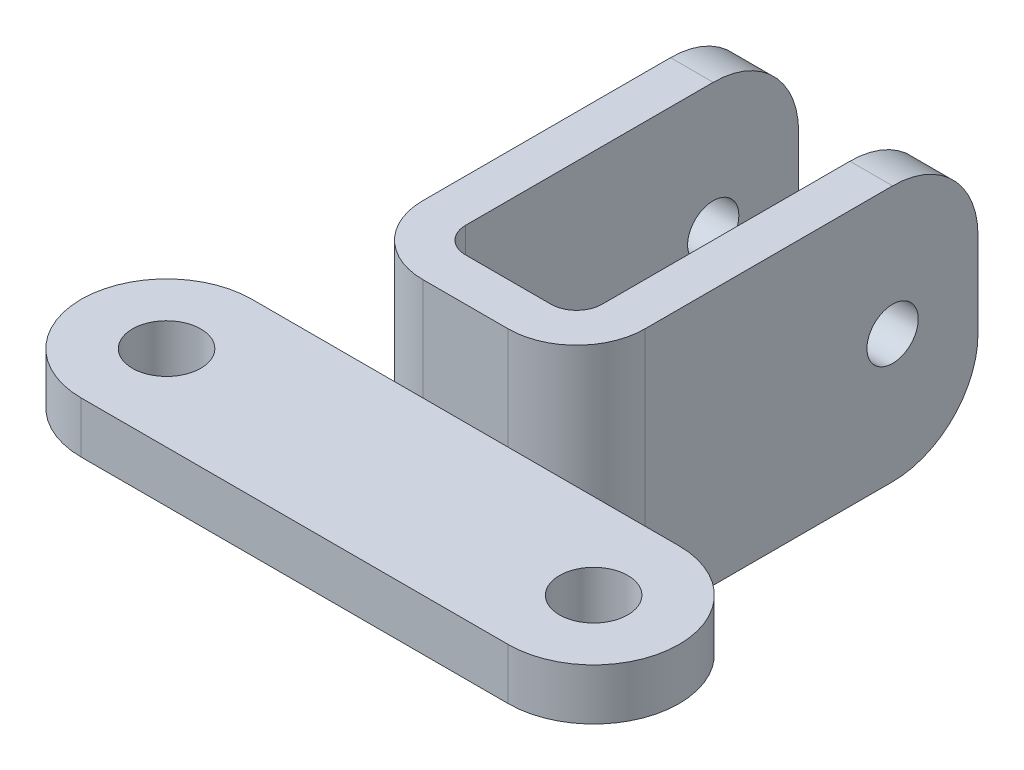
ISO-10303-21;
HEADER;
FILE_DESCRIPTION(('STEP AP214'),'2;1');
FILE_NAME('part.step','',(''),(''),'','','');
FILE_SCHEMA(('AUTOMOTIVE_DESIGN { 1 0 10303 214 1 1 1 1 }'));
ENDSEC;
DATA;
#1=APPLICATION_CONTEXT('core data for automotive mechanical design processes');
#2=APPLICATION_PROTOCOL_DEFINITION('international standard','automotive_design',2000,#1);
#3=PRODUCT_CONTEXT('',#1,'mechanical');
#4=PRODUCT('Part','Part','',(#3));
#5=PRODUCT_RELATED_PRODUCT_CATEGORY('part','',(#4));
#6=PRODUCT_DEFINITION_FORMATION('','',#4);
#7=PRODUCT_DEFINITION_CONTEXT('part definition',#1,'design');
#8=PRODUCT_DEFINITION('design','',#6,#7);
#9=PRODUCT_DEFINITION_SHAPE('','',#8);
#10=(LENGTH_UNIT() NAMED_UNIT(*) SI_UNIT(.MILLI.,.METRE.));
#11=(NAMED_UNIT(*) PLANE_ANGLE_UNIT() SI_UNIT($,.RADIAN.));
#12=(NAMED_UNIT(*) SI_UNIT($,.STERADIAN.) SOLID_ANGLE_UNIT());
#13=UNCERTAINTY_MEASURE_WITH_UNIT(LENGTH_MEASURE(1.E-05),#10,'distance_accuracy_value','');
#14=(GEOMETRIC_REPRESENTATION_CONTEXT(3) GLOBAL_UNCERTAINTY_ASSIGNED_CONTEXT((#13)) GLOBAL_UNIT_ASSIGNED_CONTEXT((#10,
#11,#12)) REPRESENTATION_CONTEXT('',''));
#15=CARTESIAN_POINT('',(0.,0.,0.));
#16=DIRECTION('',(0.,0.,1.));
#17=DIRECTION('',(1.,0.,0.));
#18=AXIS2_PLACEMENT_3D('',#15,#16,#17);
#19=CARTESIAN_POINT('',(0.,15.,0.));
#20=DIRECTION('',(0.,0.,-1.));
#21=DIRECTION('',(-1.,0.,0.));
#22=AXIS2_PLACEMENT_3D('',#19,#20,#21);
#23=PLANE('',#22);
#24=DIRECTION('',(1.,0.,0.));
#25=VECTOR('',#24,1.);
#26=CARTESIAN_POINT('',(0.,-3.,0.));
#27=LINE('',#26,#25);
#28=CARTESIAN_POINT('',(-5.,-3.,0.));
#29=VERTEX_POINT('',#28);
#30=CARTESIAN_POINT('',(4.99999999999999,-3.,0.));
#31=VERTEX_POINT('',#30);
#32=EDGE_CURVE('E57',#29,#31,#27,.T.);
#33=ORIENTED_EDGE('',*,*,#32,.F.);
#34=DIRECTION('',(0.,-1.,0.));
#35=VECTOR('',#34,1.);
#36=CARTESIAN_POINT('',(-5.,15.,0.));
#37=LINE('',#36,#35);
#38=CARTESIAN_POINT('',(-5.,-15.,0.));
#39=VERTEX_POINT('',#38);
#40=EDGE_CURVE('E308',#29,#39,#37,.T.);
#41=ORIENTED_EDGE('',*,*,#40,.T.);
#42=DIRECTION('',(1.,0.,0.));
#43=VECTOR('',#42,1.);
#44=CARTESIAN_POINT('',(0.,-15.,0.));
#45=LINE('',#44,#43);
#46=CARTESIAN_POINT('',(4.99999999999999,-15.,0.));
#47=VERTEX_POINT('',#46);
#48=EDGE_CURVE('E298',#39,#47,#45,.T.);
#49=ORIENTED_EDGE('',*,*,#48,.T.);
#50=DIRECTION('',(0.,-1.,0.));
#51=VECTOR('',#50,1.);
#52=CARTESIAN_POINT('',(4.99999999999999,15.,0.));
#53=LINE('',#52,#51);
#54=EDGE_CURVE('E304',#31,#47,#53,.T.);
#55=ORIENTED_EDGE('',*,*,#54,.F.);
#56=EDGE_LOOP('',(#33,#41,#49,#55));
#57=FACE_BOUND('',#56,.T.);
#58=ADVANCED_FACE('F41',(#57),#23,.F.);
#59=CARTESIAN_POINT('',(13.,15.,-8.));
#60=DIRECTION('',(-1.,0.,0.));
#61=DIRECTION('',(0.,0.,1.));
#62=AXIS2_PLACEMENT_3D('',#59,#60,#61);
#63=PLANE('',#62);
#64=CARTESIAN_POINT('',(13.,0.,-37.));
#65=DIRECTION('',(-1.,0.,0.));
#66=DIRECTION('',(0.,0.,1.));
#67=AXIS2_PLACEMENT_3D('',#64,#65,#66);
#68=CIRCLE('',#67,3.);
#69=CARTESIAN_POINT('',(13.,0.,-34.));
#70=VERTEX_POINT('',#69);
#71=EDGE_CURVE('E231',#70,#70,#68,.T.);
#72=ORIENTED_EDGE('',*,*,#71,.T.);
#73=EDGE_LOOP('',(#72));
#74=FACE_BOUND('',#73,.T.);
#75=DIRECTION('',(0.,-1.,0.));
#76=VECTOR('',#75,1.);
#77=CARTESIAN_POINT('',(13.,15.,-47.));
#78=LINE('',#77,#76);
#79=CARTESIAN_POINT('',(13.,5.,-47.));
#80=VERTEX_POINT('',#79);
#81=CARTESIAN_POINT('',(13.,-5.,-47.));
#82=VERTEX_POINT('',#81);
#83=EDGE_CURVE('E333',#80,#82,#78,.T.);
#84=ORIENTED_EDGE('',*,*,#83,.F.);
#85=CARTESIAN_POINT('',(13.,5.,-37.));
#86=DIRECTION('',(-1.,0.,0.));
#87=DIRECTION('',(0.,0.,1.));
#88=AXIS2_PLACEMENT_3D('',#85,#86,#87);
#89=CIRCLE('',#88,10.);
#90=CARTESIAN_POINT('',(13.,15.,-37.));
#91=VERTEX_POINT('',#90);
#92=EDGE_CURVE('E343',#80,#91,#89,.F.);
#93=ORIENTED_EDGE('',*,*,#92,.T.);
#94=DIRECTION('',(0.,0.,-1.));
#95=VECTOR('',#94,1.);
#96=CARTESIAN_POINT('',(13.,15.,-8.));
#97=LINE('',#96,#95);
#98=CARTESIAN_POINT('',(13.,15.,-8.));
#99=VERTEX_POINT('',#98);
#100=EDGE_CURVE('E251',#99,#91,#97,.T.);
#101=ORIENTED_EDGE('',*,*,#100,.F.);
#102=DIRECTION('',(0.,-1.,0.));
#103=VECTOR('',#102,1.);
#104=CARTESIAN_POINT('',(13.,15.,-8.));
#105=LINE('',#104,#103);
#106=CARTESIAN_POINT('',(13.,-15.,-8.));
#107=VERTEX_POINT('',#106);
#108=EDGE_CURVE('E277',#99,#107,#105,.T.);
#109=ORIENTED_EDGE('',*,*,#108,.T.);
#110=DIRECTION('',(0.,0.,-1.));
#111=VECTOR('',#110,1.);
#112=CARTESIAN_POINT('',(13.,-15.,-8.));
#113=LINE('',#112,#111);
#114=CARTESIAN_POINT('',(13.,-15.,-37.));
#115=VERTEX_POINT('',#114);
#116=EDGE_CURVE('E250',#107,#115,#113,.T.);
#117=ORIENTED_EDGE('',*,*,#116,.T.);
#118=CARTESIAN_POINT('',(13.,-5.,-37.));
#119=DIRECTION('',(-1.,0.,0.));
#120=DIRECTION('',(0.,0.,1.));
#121=AXIS2_PLACEMENT_3D('',#118,#119,#120);
#122=CIRCLE('',#121,10.);
#123=EDGE_CURVE('E341',#115,#82,#122,.F.);
#124=ORIENTED_EDGE('',*,*,#123,.T.);
#125=EDGE_LOOP('',(#84,#93,#101,#109,#117,#124));
#126=FACE_BOUND('',#125,.T.);
#127=ADVANCED_FACE('F426',(#74,#126),#63,.F.);
#128=CARTESIAN_POINT('',(7.99999999999999,15.,-47.));
#129=DIRECTION('',(0.,0.,-1.));
#130=DIRECTION('',(-1.,0.,0.));
#131=AXIS2_PLACEMENT_3D('',#128,#129,#130);
#132=PLANE('',#131);
#133=DIRECTION('',(0.,-1.,0.));
#134=VECTOR('',#133,1.);
#135=CARTESIAN_POINT('',(7.99999999999999,15.,-47.));
#136=LINE('',#135,#134);
#137=CARTESIAN_POINT('',(7.99999999999999,5.,-47.));
#138=VERTEX_POINT('',#137);
#139=CARTESIAN_POINT('',(7.99999999999999,-5.,-47.));
#140=VERTEX_POINT('',#139);
#141=EDGE_CURVE('E330',#138,#140,#136,.T.);
#142=ORIENTED_EDGE('',*,*,#141,.F.);
#143=DIRECTION('',(1.,0.,0.));
#144=VECTOR('',#143,1.);
#145=CARTESIAN_POINT('',(7.99999999999999,5.,-47.));
#146=LINE('',#145,#144);
#147=EDGE_CURVE('E338',#138,#80,#146,.T.);
#148=ORIENTED_EDGE('',*,*,#147,.T.);
#149=ORIENTED_EDGE('',*,*,#83,.T.);
#150=DIRECTION('',(1.,0.,0.));
#151=VECTOR('',#150,1.);
#152=CARTESIAN_POINT('',(7.99999999999999,-5.,-47.));
#153=LINE('',#152,#151);
#154=EDGE_CURVE('E336',#82,#140,#153,.F.);
#155=ORIENTED_EDGE('',*,*,#154,.T.);
#156=EDGE_LOOP('',(#142,#148,#149,#155));
#157=FACE_BOUND('',#156,.T.);
#158=ADVANCED_FACE('F433',(#157),#132,.T.);
#159=CARTESIAN_POINT('',(7.99999999999999,15.,-8.));
#160=DIRECTION('',(-1.,0.,0.));
#161=DIRECTION('',(0.,0.,1.));
#162=AXIS2_PLACEMENT_3D('',#159,#160,#161);
#163=PLANE('',#162);
#164=CARTESIAN_POINT('',(7.99999999999999,0.,-37.));
#165=DIRECTION('',(-1.,0.,0.));
#166=DIRECTION('',(0.,0.,1.));
#167=AXIS2_PLACEMENT_3D('',#164,#165,#166);
#168=CIRCLE('',#167,3.);
#169=CARTESIAN_POINT('',(7.99999999999999,0.,-34.));
#170=VERTEX_POINT('',#169);
#171=EDGE_CURVE('E488',#170,#170,#168,.T.);
#172=ORIENTED_EDGE('',*,*,#171,.F.);
#173=EDGE_LOOP('',(#172));
#174=FACE_BOUND('',#173,.T.);
#175=DIRECTION('',(0.,0.,-1.));
#176=VECTOR('',#175,1.);
#177=CARTESIAN_POINT('',(7.99999999999999,15.,-8.));
#178=LINE('',#177,#176);
#179=CARTESIAN_POINT('',(7.99999999999999,15.,-8.));
#180=VERTEX_POINT('',#179);
#181=CARTESIAN_POINT('',(7.99999999999999,15.,-37.));
#182=VERTEX_POINT('',#181);
#183=EDGE_CURVE('E254',#180,#182,#178,.T.);
#184=ORIENTED_EDGE('',*,*,#183,.T.);
#185=CARTESIAN_POINT('',(7.99999999999999,5.,-37.));
#186=DIRECTION('',(-1.,0.,0.));
#187=DIRECTION('',(0.,0.,1.));
#188=AXIS2_PLACEMENT_3D('',#185,#186,#187);
#189=CIRCLE('',#188,10.);
#190=EDGE_CURVE('E351',#182,#138,#189,.T.);
#191=ORIENTED_EDGE('',*,*,#190,.T.);
#192=ORIENTED_EDGE('',*,*,#141,.T.);
#193=CARTESIAN_POINT('',(7.99999999999999,-5.,-37.));
#194=DIRECTION('',(-1.,0.,0.));
#195=DIRECTION('',(0.,0.,1.));
#196=AXIS2_PLACEMENT_3D('',#193,#194,#195);
#197=CIRCLE('',#196,10.);
#198=CARTESIAN_POINT('',(7.99999999999999,-15.,-37.));
#199=VERTEX_POINT('',#198);
#200=EDGE_CURVE('E349',#140,#199,#197,.T.);
#201=ORIENTED_EDGE('',*,*,#200,.T.);
#202=DIRECTION('',(0.,0.,-1.));
#203=VECTOR('',#202,1.);
#204=CARTESIAN_POINT('',(7.99999999999999,-15.,-8.));
#205=LINE('',#204,#203);
#206=CARTESIAN_POINT('',(7.99999999999999,-15.,-8.));
#207=VERTEX_POINT('',#206);
#208=EDGE_CURVE('E280',#207,#199,#205,.T.);
#209=ORIENTED_EDGE('',*,*,#208,.F.);
#210=DIRECTION('',(0.,-1.,0.));
#211=VECTOR('',#210,1.);
#212=CARTESIAN_POINT('',(7.99999999999999,15.,-8.));
#213=LINE('',#212,#211);
#214=EDGE_CURVE('E328',#180,#207,#213,.T.);
#215=ORIENTED_EDGE('',*,*,#214,.F.);
#216=EDGE_LOOP('',(#184,#191,#192,#201,#209,#215));
#217=FACE_BOUND('',#216,.T.);
#218=ADVANCED_FACE('F437',(#174,#217),#163,.T.);
#219=CARTESIAN_POINT('',(4.99999999999999,15.,-8.));
#220=DIRECTION('',(0.,-1.,0.));
#221=DIRECTION('',(0.,0.,-1.));
#222=AXIS2_PLACEMENT_3D('',#219,#220,#221);
#223=CYLINDRICAL_SURFACE('',#222,3.);
#224=CARTESIAN_POINT('',(4.99999999999999,-15.,-8.));
#225=DIRECTION('',(0.,1.,0.));
#226=DIRECTION('',(1.,0.,0.));
#227=AXIS2_PLACEMENT_3D('',#224,#225,#226);
#228=CIRCLE('',#227,3.);
#229=CARTESIAN_POINT('',(4.99999999999999,-15.,-5.));
#230=VERTEX_POINT('',#229);
#231=EDGE_CURVE('E283',#230,#207,#228,.T.);
#232=ORIENTED_EDGE('',*,*,#231,.F.);
#233=DIRECTION('',(0.,-1.,0.));
#234=VECTOR('',#233,1.);
#235=CARTESIAN_POINT('',(4.99999999999999,15.,-5.));
#236=LINE('',#235,#234);
#237=CARTESIAN_POINT('',(4.99999999999999,15.,-5.));
#238=VERTEX_POINT('',#237);
#239=EDGE_CURVE('E325',#238,#230,#236,.T.);
#240=ORIENTED_EDGE('',*,*,#239,.F.);
#241=CARTESIAN_POINT('',(4.99999999999999,15.,-8.));
#242=DIRECTION('',(0.,1.,0.));
#243=DIRECTION('',(1.,0.,0.));
#244=AXIS2_PLACEMENT_3D('',#241,#242,#243);
#245=CIRCLE('',#244,3.);
#246=EDGE_CURVE('E258',#238,#180,#245,.T.);
#247=ORIENTED_EDGE('',*,*,#246,.T.);
#248=ORIENTED_EDGE('',*,*,#214,.T.);
#249=EDGE_LOOP('',(#232,#240,#247,#248));
#250=FACE_BOUND('',#249,.T.);
#251=ADVANCED_FACE('F445',(#250),#223,.F.);
#252=CARTESIAN_POINT('',(-5.,15.,-5.));
#253=DIRECTION('',(0.,0.,-1.));
#254=DIRECTION('',(-1.,0.,0.));
#255=AXIS2_PLACEMENT_3D('',#252,#253,#254);
#256=PLANE('',#255);
#257=DIRECTION('',(1.,0.,0.));
#258=VECTOR('',#257,1.);
#259=CARTESIAN_POINT('',(-5.,-15.,-5.));
#260=LINE('',#259,#258);
#261=CARTESIAN_POINT('',(-5.,-15.,-5.));
#262=VERTEX_POINT('',#261);
#263=EDGE_CURVE('E286',#262,#230,#260,.T.);
#264=ORIENTED_EDGE('',*,*,#263,.F.);
#265=DIRECTION('',(0.,-1.,0.));
#266=VECTOR('',#265,1.);
#267=CARTESIAN_POINT('',(-5.,15.,-5.));
#268=LINE('',#267,#266);
#269=CARTESIAN_POINT('',(-5.,15.,-5.));
#270=VERTEX_POINT('',#269);
#271=EDGE_CURVE('E323',#270,#262,#268,.T.);
#272=ORIENTED_EDGE('',*,*,#271,.F.);
#273=DIRECTION('',(1.,0.,0.));
#274=VECTOR('',#273,1.);
#275=CARTESIAN_POINT('',(0.,15.,-5.));
#276=LINE('',#275,#274);
#277=EDGE_CURVE('E261',#270,#238,#276,.T.);
#278=ORIENTED_EDGE('',*,*,#277,.T.);
#279=ORIENTED_EDGE('',*,*,#239,.T.);
#280=EDGE_LOOP('',(#264,#272,#278,#279));
#281=FACE_BOUND('',#280,.T.);
#282=ADVANCED_FACE('F447',(#281),#256,.T.);
#283=CARTESIAN_POINT('',(-5.,15.,-8.));
#284=DIRECTION('',(0.,-1.,0.));
#285=DIRECTION('',(0.,0.,-1.));
#286=AXIS2_PLACEMENT_3D('',#283,#284,#285);
#287=CYLINDRICAL_SURFACE('',#286,3.);
#288=CARTESIAN_POINT('',(-5.,-15.,-8.));
#289=DIRECTION('',(0.,1.,0.));
#290=DIRECTION('',(1.,0.,0.));
#291=AXIS2_PLACEMENT_3D('',#288,#289,#290);
#292=CIRCLE('',#291,3.);
#293=CARTESIAN_POINT('',(-8.,-15.,-8.));
#294=VERTEX_POINT('',#293);
#295=EDGE_CURVE('E288',#294,#262,#292,.T.);
#296=ORIENTED_EDGE('',*,*,#295,.F.);
#297=DIRECTION('',(0.,-1.,0.));
#298=VECTOR('',#297,1.);
#299=CARTESIAN_POINT('',(-8.,15.,-8.));
#300=LINE('',#299,#298);
#301=CARTESIAN_POINT('',(-8.,15.,-8.));
#302=VERTEX_POINT('',#301);
#303=EDGE_CURVE('E320',#302,#294,#300,.T.);
#304=ORIENTED_EDGE('',*,*,#303,.F.);
#305=CARTESIAN_POINT('',(-5.,15.,-8.));
#306=DIRECTION('',(0.,1.,0.));
#307=DIRECTION('',(1.,0.,0.));
#308=AXIS2_PLACEMENT_3D('',#305,#306,#307);
#309=CIRCLE('',#308,3.);
#310=EDGE_CURVE('E264',#302,#270,#309,.T.);
#311=ORIENTED_EDGE('',*,*,#310,.T.);
#312=ORIENTED_EDGE('',*,*,#271,.T.);
#313=EDGE_LOOP('',(#296,#304,#311,#312));
#314=FACE_BOUND('',#313,.T.);
#315=ADVANCED_FACE('F390',(#314),#287,.F.);
#316=CARTESIAN_POINT('',(-8.,15.,-47.));
#317=DIRECTION('',(1.,0.,0.));
#318=DIRECTION('',(0.,0.,-1.));
#319=AXIS2_PLACEMENT_3D('',#316,#317,#318);
#320=PLANE('',#319);
#321=CARTESIAN_POINT('',(-8.,0.,-37.));
#322=DIRECTION('',(1.,0.,0.));
#323=DIRECTION('',(0.,0.,-1.));
#324=AXIS2_PLACEMENT_3D('',#321,#322,#323);
#325=CIRCLE('',#324,3.);
#326=CARTESIAN_POINT('',(-8.,0.,-40.));
#327=VERTEX_POINT('',#326);
#328=EDGE_CURVE('E486',#327,#327,#325,.T.);
#329=ORIENTED_EDGE('',*,*,#328,.F.);
#330=EDGE_LOOP('',(#329));
#331=FACE_BOUND('',#330,.T.);
#332=DIRECTION('',(0.,0.,1.));
#333=VECTOR('',#332,1.);
#334=CARTESIAN_POINT('',(-8.,-15.,-47.));
#335=LINE('',#334,#333);
#336=CARTESIAN_POINT('',(-8.,-15.,-37.));
#337=VERTEX_POINT('',#336);
#338=EDGE_CURVE('E291',#337,#294,#335,.T.);
#339=ORIENTED_EDGE('',*,*,#338,.F.);
#340=CARTESIAN_POINT('',(-8.,-5.,-37.));
#341=DIRECTION('',(1.,0.,0.));
#342=DIRECTION('',(0.,0.,-1.));
#343=AXIS2_PLACEMENT_3D('',#340,#341,#342);
#344=CIRCLE('',#343,10.);
#345=CARTESIAN_POINT('',(-8.,-5.,-47.));
#346=VERTEX_POINT('',#345);
#347=EDGE_CURVE('E361',#337,#346,#344,.T.);
#348=ORIENTED_EDGE('',*,*,#347,.T.);
#349=DIRECTION('',(0.,-1.,0.));
#350=VECTOR('',#349,1.);
#351=CARTESIAN_POINT('',(-8.,15.,-47.));
#352=LINE('',#351,#350);
#353=CARTESIAN_POINT('',(-8.,5.,-47.));
#354=VERTEX_POINT('',#353);
#355=EDGE_CURVE('E318',#354,#346,#352,.T.);
#356=ORIENTED_EDGE('',*,*,#355,.F.);
#357=CARTESIAN_POINT('',(-8.,5.,-37.));
#358=DIRECTION('',(1.,0.,0.));
#359=DIRECTION('',(0.,0.,-1.));
#360=AXIS2_PLACEMENT_3D('',#357,#358,#359);
#361=CIRCLE('',#360,10.);
#362=CARTESIAN_POINT('',(-8.,15.,-37.));
#363=VERTEX_POINT('',#362);
#364=EDGE_CURVE('E359',#354,#363,#361,.T.);
#365=ORIENTED_EDGE('',*,*,#364,.T.);
#366=DIRECTION('',(0.,0.,1.));
#367=VECTOR('',#366,1.);
#368=CARTESIAN_POINT('',(-8.,15.,-47.));
#369=LINE('',#368,#367);
#370=EDGE_CURVE('E267',#363,#302,#369,.T.);
#371=ORIENTED_EDGE('',*,*,#370,.T.);
#372=ORIENTED_EDGE('',*,*,#303,.T.);
#373=EDGE_LOOP('',(#339,#348,#356,#365,#371,#372));
#374=FACE_BOUND('',#373,.T.);
#375=ADVANCED_FACE('F381',(#331,#374),#320,.T.);
#376=CARTESIAN_POINT('',(-13.,15.,-47.));
#377=DIRECTION('',(0.,0.,-1.));
#378=DIRECTION('',(-1.,0.,0.));
#379=AXIS2_PLACEMENT_3D('',#376,#377,#378);
#380=PLANE('',#379);
#381=ORIENTED_EDGE('',*,*,#355,.T.);
#382=DIRECTION('',(1.,0.,0.));
#383=VECTOR('',#382,1.);
#384=CARTESIAN_POINT('',(-13.,-5.,-47.));
#385=LINE('',#384,#383);
#386=CARTESIAN_POINT('',(-13.,-5.,-47.));
#387=VERTEX_POINT('',#386);
#388=EDGE_CURVE('E65',#346,#387,#385,.F.);
#389=ORIENTED_EDGE('',*,*,#388,.T.);
#390=DIRECTION('',(0.,-1.,0.));
#391=VECTOR('',#390,1.);
#392=CARTESIAN_POINT('',(-13.,15.,-47.));
#393=LINE('',#392,#391);
#394=CARTESIAN_POINT('',(-13.,5.,-47.));
#395=VERTEX_POINT('',#394);
#396=EDGE_CURVE('E316',#395,#387,#393,.T.);
#397=ORIENTED_EDGE('',*,*,#396,.F.);
#398=DIRECTION('',(1.,0.,0.));
#399=VECTOR('',#398,1.);
#400=CARTESIAN_POINT('',(-13.,5.,-47.));
#401=LINE('',#400,#399);
#402=EDGE_CURVE('E363',#395,#354,#401,.T.);
#403=ORIENTED_EDGE('',*,*,#402,.T.);
#404=EDGE_LOOP('',(#381,#389,#397,#403));
#405=FACE_BOUND('',#404,.T.);
#406=ADVANCED_FACE('F376',(#405),#380,.T.);
#407=CARTESIAN_POINT('',(-13.,15.,-47.));
#408=DIRECTION('',(1.,0.,0.));
#409=DIRECTION('',(0.,0.,-1.));
#410=AXIS2_PLACEMENT_3D('',#407,#408,#409);
#411=PLANE('',#410);
#412=CARTESIAN_POINT('',(-13.,0.,-37.));
#413=DIRECTION('',(1.,0.,0.));
#414=DIRECTION('',(0.,0.,-1.));
#415=AXIS2_PLACEMENT_3D('',#412,#413,#414);
#416=CIRCLE('',#415,3.);
#417=CARTESIAN_POINT('',(-13.,0.,-40.));
#418=VERTEX_POINT('',#417);
#419=EDGE_CURVE('E45',#418,#418,#416,.T.);
#420=ORIENTED_EDGE('',*,*,#419,.T.);
#421=EDGE_LOOP('',(#420));
#422=FACE_BOUND('',#421,.T.);
#423=ORIENTED_EDGE('',*,*,#396,.T.);
#424=CARTESIAN_POINT('',(-13.,-5.,-37.));
#425=DIRECTION('',(1.,0.,0.));
#426=DIRECTION('',(0.,0.,-1.));
#427=AXIS2_PLACEMENT_3D('',#424,#425,#426);
#428=CIRCLE('',#427,10.);
#429=CARTESIAN_POINT('',(-13.,-15.,-37.));
#430=VERTEX_POINT('',#429);
#431=EDGE_CURVE('E11',#387,#430,#428,.F.);
#432=ORIENTED_EDGE('',*,*,#431,.T.);
#433=DIRECTION('',(0.,0.,1.));
#434=VECTOR('',#433,1.);
#435=CARTESIAN_POINT('',(-13.,-15.,-47.));
#436=LINE('',#435,#434);
#437=CARTESIAN_POINT('',(-13.,-15.,-8.));
#438=VERTEX_POINT('',#437);
#439=EDGE_CURVE('E293',#430,#438,#436,.T.);
#440=ORIENTED_EDGE('',*,*,#439,.T.);
#441=DIRECTION('',(0.,-1.,0.));
#442=VECTOR('',#441,1.);
#443=CARTESIAN_POINT('',(-13.,15.,-8.));
#444=LINE('',#443,#442);
#445=CARTESIAN_POINT('',(-13.,15.,-8.));
#446=VERTEX_POINT('',#445);
#447=EDGE_CURVE('E313',#446,#438,#444,.T.);
#448=ORIENTED_EDGE('',*,*,#447,.F.);
#449=DIRECTION('',(0.,0.,1.));
#450=VECTOR('',#449,1.);
#451=CARTESIAN_POINT('',(-13.,15.,-47.));
#452=LINE('',#451,#450);
#453=CARTESIAN_POINT('',(-13.,15.,-37.));
#454=VERTEX_POINT('',#453);
#455=EDGE_CURVE('E269',#454,#446,#452,.T.);
#456=ORIENTED_EDGE('',*,*,#455,.F.);
#457=CARTESIAN_POINT('',(-13.,5.,-37.));
#458=DIRECTION('',(1.,0.,0.));
#459=DIRECTION('',(0.,0.,-1.));
#460=AXIS2_PLACEMENT_3D('',#457,#458,#459);
#461=CIRCLE('',#460,10.);
#462=EDGE_CURVE('E50',#454,#395,#461,.F.);
#463=ORIENTED_EDGE('',*,*,#462,.T.);
#464=EDGE_LOOP('',(#423,#432,#440,#448,#456,#463));
#465=FACE_BOUND('',#464,.T.);
#466=ADVANCED_FACE('F370',(#422,#465),#411,.F.);
#467=CARTESIAN_POINT('',(-5.,15.,-8.));
#468=DIRECTION('',(0.,-1.,0.));
#469=DIRECTION('',(0.,0.,-1.));
#470=AXIS2_PLACEMENT_3D('',#467,#468,#469);
#471=CYLINDRICAL_SURFACE('',#470,8.);
#472=CARTESIAN_POINT('',(-5.,-15.,-8.));
#473=DIRECTION('',(0.,1.,0.));
#474=DIRECTION('',(0.,0.,1.));
#475=AXIS2_PLACEMENT_3D('',#472,#473,#474);
#476=CIRCLE('',#475,8.);
#477=EDGE_CURVE('E295',#438,#39,#476,.T.);
#478=ORIENTED_EDGE('',*,*,#477,.T.);
#479=ORIENTED_EDGE('',*,*,#40,.F.);
#480=DIRECTION('',(0.,-1.,0.));
#481=VECTOR('',#480,1.);
#482=CARTESIAN_POINT('',(-5.,15.,0.));
#483=LINE('',#482,#481);
#484=CARTESIAN_POINT('',(-5.,3.,0.));
#485=VERTEX_POINT('',#484);
#486=EDGE_CURVE('E204',#485,#29,#483,.T.);
#487=ORIENTED_EDGE('',*,*,#486,.F.);
#488=CARTESIAN_POINT('',(-5.,15.,0.));
#489=VERTEX_POINT('',#488);
#490=EDGE_CURVE('E310',#489,#485,#37,.T.);
#491=ORIENTED_EDGE('',*,*,#490,.F.);
#492=CARTESIAN_POINT('',(-5.,15.,-8.));
#493=DIRECTION('',(0.,1.,0.));
#494=DIRECTION('',(0.,0.,1.));
#495=AXIS2_PLACEMENT_3D('',#492,#493,#494);
#496=CIRCLE('',#495,8.);
#497=EDGE_CURVE('E271',#446,#489,#496,.T.);
#498=ORIENTED_EDGE('',*,*,#497,.F.);
#499=ORIENTED_EDGE('',*,*,#447,.T.);
#500=EDGE_LOOP('',(#478,#479,#487,#491,#498,#499));
#501=FACE_BOUND('',#500,.T.);
#502=ADVANCED_FACE('F401',(#501),#471,.T.);
#503=ORIENTED_EDGE('',*,*,#490,.T.);
#504=DIRECTION('',(1.,0.,0.));
#505=VECTOR('',#504,1.);
#506=CARTESIAN_POINT('',(0.,3.,0.));
#507=LINE('',#506,#505);
#508=CARTESIAN_POINT('',(4.99999999999999,3.,0.));
#509=VERTEX_POINT('',#508);
#510=EDGE_CURVE('E226',#485,#509,#507,.T.);
#511=ORIENTED_EDGE('',*,*,#510,.T.);
#512=CARTESIAN_POINT('',(4.99999999999999,15.,0.));
#513=VERTEX_POINT('',#512);
#514=EDGE_CURVE('E305',#513,#509,#53,.T.);
#515=ORIENTED_EDGE('',*,*,#514,.F.);
#516=DIRECTION('',(1.,0.,0.));
#517=VECTOR('',#516,1.);
#518=CARTESIAN_POINT('',(-5.,15.,0.));
#519=LINE('',#518,#517);
#520=EDGE_CURVE('E273',#489,#513,#519,.T.);
#521=ORIENTED_EDGE('',*,*,#520,.F.);
#522=EDGE_LOOP('',(#503,#511,#515,#521));
#523=FACE_BOUND('',#522,.T.);
#524=ADVANCED_FACE('F416',(#523),#23,.F.);
#525=CARTESIAN_POINT('',(4.99999999999999,15.,-8.));
#526=DIRECTION('',(0.,-1.,0.));
#527=DIRECTION('',(0.,0.,-1.));
#528=AXIS2_PLACEMENT_3D('',#525,#526,#527);
#529=CYLINDRICAL_SURFACE('',#528,8.);
#530=CARTESIAN_POINT('',(4.99999999999999,-15.,-8.));
#531=DIRECTION('',(0.,1.,0.));
#532=DIRECTION('',(0.,0.,1.));
#533=AXIS2_PLACEMENT_3D('',#530,#531,#532);
#534=CIRCLE('',#533,8.);
#535=EDGE_CURVE('E255',#47,#107,#534,.T.);
#536=ORIENTED_EDGE('',*,*,#535,.T.);
#537=ORIENTED_EDGE('',*,*,#108,.F.);
#538=CARTESIAN_POINT('',(4.99999999999999,15.,-8.));
#539=DIRECTION('',(0.,1.,0.));
#540=DIRECTION('',(0.,0.,1.));
#541=AXIS2_PLACEMENT_3D('',#538,#539,#540);
#542=CIRCLE('',#541,8.);
#543=EDGE_CURVE('E275',#513,#99,#542,.T.);
#544=ORIENTED_EDGE('',*,*,#543,.F.);
#545=ORIENTED_EDGE('',*,*,#514,.T.);
#546=EDGE_CURVE('E309',#509,#31,#53,.T.);
#547=ORIENTED_EDGE('',*,*,#546,.T.);
#548=ORIENTED_EDGE('',*,*,#54,.T.);
#549=EDGE_LOOP('',(#536,#537,#544,#545,#547,#548));
#550=FACE_BOUND('',#549,.T.);
#551=ADVANCED_FACE('F423',(#550),#529,.T.);
#552=CARTESIAN_POINT('',(4.99999999999999,15.,-8.));
#553=DIRECTION('',(0.,1.,0.));
#554=DIRECTION('',(1.,0.,0.));
#555=AXIS2_PLACEMENT_3D('',#552,#553,#554);
#556=PLANE('',#555);
#557=ORIENTED_EDGE('',*,*,#100,.T.);
#558=DIRECTION('',(1.,0.,0.));
#559=VECTOR('',#558,1.);
#560=CARTESIAN_POINT('',(4.99999999999999,15.,-37.));
#561=LINE('',#560,#559);
#562=EDGE_CURVE('E347',#91,#182,#561,.F.);
#563=ORIENTED_EDGE('',*,*,#562,.T.);
#564=ORIENTED_EDGE('',*,*,#183,.F.);
#565=ORIENTED_EDGE('',*,*,#246,.F.);
#566=ORIENTED_EDGE('',*,*,#277,.F.);
#567=ORIENTED_EDGE('',*,*,#310,.F.);
#568=ORIENTED_EDGE('',*,*,#370,.F.);
#569=DIRECTION('',(1.,0.,0.));
#570=VECTOR('',#569,1.);
#571=CARTESIAN_POINT('',(4.99999999999999,15.,-37.));
#572=LINE('',#571,#570);
#573=EDGE_CURVE('E345',#363,#454,#572,.F.);
#574=ORIENTED_EDGE('',*,*,#573,.T.);
#575=ORIENTED_EDGE('',*,*,#455,.T.);
#576=ORIENTED_EDGE('',*,*,#497,.T.);
#577=ORIENTED_EDGE('',*,*,#520,.T.);
#578=ORIENTED_EDGE('',*,*,#543,.T.);
#579=EDGE_LOOP('',(#557,#563,#564,#565,#566,#567,#568,#574,#575,#576,#577,#578));
#580=FACE_BOUND('',#579,.T.);
#581=ADVANCED_FACE('F385',(#580),#556,.T.);
#582=CARTESIAN_POINT('',(4.99999999999999,-15.,-8.));
#583=DIRECTION('',(0.,1.,0.));
#584=DIRECTION('',(1.,0.,0.));
#585=AXIS2_PLACEMENT_3D('',#582,#583,#584);
#586=PLANE('',#585);
#587=ORIENTED_EDGE('',*,*,#208,.T.);
#588=DIRECTION('',(1.,0.,0.));
#589=VECTOR('',#588,1.);
#590=CARTESIAN_POINT('',(13.,-15.,-37.));
#591=LINE('',#590,#589);
#592=EDGE_CURVE('E356',#199,#115,#591,.T.);
#593=ORIENTED_EDGE('',*,*,#592,.T.);
#594=ORIENTED_EDGE('',*,*,#116,.F.);
#595=ORIENTED_EDGE('',*,*,#535,.F.);
#596=ORIENTED_EDGE('',*,*,#48,.F.);
#597=ORIENTED_EDGE('',*,*,#477,.F.);
#598=ORIENTED_EDGE('',*,*,#439,.F.);
#599=DIRECTION('',(1.,0.,0.));
#600=VECTOR('',#599,1.);
#601=CARTESIAN_POINT('',(-8.,-15.,-37.));
#602=LINE('',#601,#600);
#603=EDGE_CURVE('E353',#430,#337,#602,.T.);
#604=ORIENTED_EDGE('',*,*,#603,.T.);
#605=ORIENTED_EDGE('',*,*,#338,.T.);
#606=ORIENTED_EDGE('',*,*,#295,.T.);
#607=ORIENTED_EDGE('',*,*,#263,.T.);
#608=ORIENTED_EDGE('',*,*,#231,.T.);
#609=EDGE_LOOP('',(#587,#593,#594,#595,#596,#597,#598,#604,#605,#606,#607,#608));
#610=FACE_BOUND('',#609,.T.);
#611=ADVANCED_FACE('F393',(#610),#586,.F.);
#612=CARTESIAN_POINT('',(7.99999999999999,5.,-37.));
#613=DIRECTION('',(1.,0.,0.));
#614=DIRECTION('',(0.,0.,-1.));
#615=AXIS2_PLACEMENT_3D('',#612,#613,#614);
#616=CYLINDRICAL_SURFACE('',#615,10.);
#617=ORIENTED_EDGE('',*,*,#190,.F.);
#618=ORIENTED_EDGE('',*,*,#562,.F.);
#619=ORIENTED_EDGE('',*,*,#92,.F.);
#620=ORIENTED_EDGE('',*,*,#147,.F.);
#621=EDGE_LOOP('',(#617,#618,#619,#620));
#622=FACE_BOUND('',#621,.T.);
#623=ADVANCED_FACE('F430',(#622),#616,.T.);
#624=CARTESIAN_POINT('',(4.99999999999999,-5.,-37.));
#625=DIRECTION('',(-1.,0.,0.));
#626=DIRECTION('',(0.,0.,1.));
#627=AXIS2_PLACEMENT_3D('',#624,#625,#626);
#628=CYLINDRICAL_SURFACE('',#627,10.);
#629=ORIENTED_EDGE('',*,*,#200,.F.);
#630=ORIENTED_EDGE('',*,*,#154,.F.);
#631=ORIENTED_EDGE('',*,*,#123,.F.);
#632=ORIENTED_EDGE('',*,*,#592,.F.);
#633=EDGE_LOOP('',(#629,#630,#631,#632));
#634=FACE_BOUND('',#633,.T.);
#635=ADVANCED_FACE('F441',(#634),#628,.T.);
#636=CARTESIAN_POINT('',(4.99999999999999,-5.,-37.));
#637=DIRECTION('',(-1.,0.,0.));
#638=DIRECTION('',(0.,0.,1.));
#639=AXIS2_PLACEMENT_3D('',#636,#637,#638);
#640=CYLINDRICAL_SURFACE('',#639,10.);
#641=ORIENTED_EDGE('',*,*,#431,.F.);
#642=ORIENTED_EDGE('',*,*,#388,.F.);
#643=ORIENTED_EDGE('',*,*,#347,.F.);
#644=ORIENTED_EDGE('',*,*,#603,.F.);
#645=EDGE_LOOP('',(#641,#642,#643,#644));
#646=FACE_BOUND('',#645,.T.);
#647=ADVANCED_FACE('F398',(#646),#640,.T.);
#648=CARTESIAN_POINT('',(-13.,5.,-37.));
#649=DIRECTION('',(1.,0.,0.));
#650=DIRECTION('',(0.,0.,-1.));
#651=AXIS2_PLACEMENT_3D('',#648,#649,#650);
#652=CYLINDRICAL_SURFACE('',#651,10.);
#653=ORIENTED_EDGE('',*,*,#462,.F.);
#654=ORIENTED_EDGE('',*,*,#573,.F.);
#655=ORIENTED_EDGE('',*,*,#364,.F.);
#656=ORIENTED_EDGE('',*,*,#402,.F.);
#657=EDGE_LOOP('',(#653,#654,#655,#656));
#658=FACE_BOUND('',#657,.T.);
#659=ADVANCED_FACE('F43',(#658),#652,.T.);
#660=CARTESIAN_POINT('',(0.,3.,0.));
#661=DIRECTION('',(0.,0.,-1.));
#662=DIRECTION('',(-1.,0.,0.));
#663=AXIS2_PLACEMENT_3D('',#660,#661,#662);
#664=PLANE('',#663);
#665=ORIENTED_EDGE('',*,*,#546,.F.);
#666=CARTESIAN_POINT('',(25.,3.,0.));
#667=VERTEX_POINT('',#666);
#668=EDGE_CURVE('E220',#509,#667,#507,.T.);
#669=ORIENTED_EDGE('',*,*,#668,.T.);
#670=DIRECTION('',(0.,-1.,0.));
#671=VECTOR('',#670,1.);
#672=CARTESIAN_POINT('',(25.,3.,0.));
#673=LINE('',#672,#671);
#674=CARTESIAN_POINT('',(25.,-3.,0.));
#675=VERTEX_POINT('',#674);
#676=EDGE_CURVE('E245',#667,#675,#673,.T.);
#677=ORIENTED_EDGE('',*,*,#676,.T.);
#678=EDGE_CURVE('E240',#31,#675,#27,.T.);
#679=ORIENTED_EDGE('',*,*,#678,.F.);
#680=EDGE_LOOP('',(#665,#669,#677,#679));
#681=FACE_BOUND('',#680,.T.);
#682=ADVANCED_FACE('F517',(#681),#664,.T.);
#683=CARTESIAN_POINT('',(-25.,3.,10.));
#684=DIRECTION('',(0.,-1.,0.));
#685=DIRECTION('',(0.,0.,-1.));
#686=AXIS2_PLACEMENT_3D('',#683,#684,#685);
#687=CYLINDRICAL_SURFACE('',#686,10.);
#688=CARTESIAN_POINT('',(-25.,-3.,10.));
#689=DIRECTION('',(0.,1.,0.));
#690=DIRECTION('',(0.,0.,1.));
#691=AXIS2_PLACEMENT_3D('',#688,#689,#690);
#692=CIRCLE('',#691,10.);
#693=CARTESIAN_POINT('',(-25.,-3.,20.));
#694=VERTEX_POINT('',#693);
#695=CARTESIAN_POINT('',(-25.,-3.,0.));
#696=VERTEX_POINT('',#695);
#697=EDGE_CURVE('E199',#694,#696,#692,.F.);
#698=ORIENTED_EDGE('',*,*,#697,.F.);
#699=DIRECTION('',(0.,-1.,0.));
#700=VECTOR('',#699,1.);
#701=CARTESIAN_POINT('',(-25.,3.,20.));
#702=LINE('',#701,#700);
#703=CARTESIAN_POINT('',(-25.,3.,20.));
#704=VERTEX_POINT('',#703);
#705=EDGE_CURVE('E193',#704,#694,#702,.T.);
#706=ORIENTED_EDGE('',*,*,#705,.F.);
#707=CARTESIAN_POINT('',(-25.,3.,10.));
#708=DIRECTION('',(0.,1.,0.));
#709=DIRECTION('',(0.,0.,1.));
#710=AXIS2_PLACEMENT_3D('',#707,#708,#709);
#711=CIRCLE('',#710,10.);
#712=CARTESIAN_POINT('',(-25.,3.,0.));
#713=VERTEX_POINT('',#712);
#714=EDGE_CURVE('E196',#704,#713,#711,.F.);
#715=ORIENTED_EDGE('',*,*,#714,.T.);
#716=DIRECTION('',(0.,-1.,0.));
#717=VECTOR('',#716,1.);
#718=CARTESIAN_POINT('',(-25.,3.,0.));
#719=LINE('',#718,#717);
#720=EDGE_CURVE('E225',#713,#696,#719,.T.);
#721=ORIENTED_EDGE('',*,*,#720,.T.);
#722=EDGE_LOOP('',(#698,#706,#715,#721));
#723=FACE_BOUND('',#722,.T.);
#724=ADVANCED_FACE('F195',(#723),#687,.T.);
#725=CARTESIAN_POINT('',(0.,3.,20.));
#726=DIRECTION('',(0.,0.,1.));
#727=DIRECTION('',(1.,0.,0.));
#728=AXIS2_PLACEMENT_3D('',#725,#726,#727);
#729=PLANE('',#728);
#730=DIRECTION('',(-1.,0.,0.));
#731=VECTOR('',#730,1.);
#732=CARTESIAN_POINT('',(0.,-3.,20.));
#733=LINE('',#732,#731);
#734=CARTESIAN_POINT('',(25.,-3.,20.));
#735=VERTEX_POINT('',#734);
#736=EDGE_CURVE('E235',#735,#694,#733,.T.);
#737=ORIENTED_EDGE('',*,*,#736,.F.);
#738=DIRECTION('',(0.,-1.,0.));
#739=VECTOR('',#738,1.);
#740=CARTESIAN_POINT('',(25.,3.,20.));
#741=LINE('',#740,#739);
#742=CARTESIAN_POINT('',(25.,3.,20.));
#743=VERTEX_POINT('',#742);
#744=EDGE_CURVE('E205',#743,#735,#741,.T.);
#745=ORIENTED_EDGE('',*,*,#744,.F.);
#746=DIRECTION('',(-1.,0.,0.));
#747=VECTOR('',#746,1.);
#748=CARTESIAN_POINT('',(0.,3.,20.));
#749=LINE('',#748,#747);
#750=EDGE_CURVE('E211',#743,#704,#749,.T.);
#751=ORIENTED_EDGE('',*,*,#750,.T.);
#752=ORIENTED_EDGE('',*,*,#705,.T.);
#753=EDGE_LOOP('',(#737,#745,#751,#752));
#754=FACE_BOUND('',#753,.T.);
#755=ADVANCED_FACE('F217',(#754),#729,.T.);
#756=CARTESIAN_POINT('',(25.,3.,10.));
#757=DIRECTION('',(0.,-1.,0.));
#758=DIRECTION('',(0.,0.,-1.));
#759=AXIS2_PLACEMENT_3D('',#756,#757,#758);
#760=CYLINDRICAL_SURFACE('',#759,10.);
#761=CARTESIAN_POINT('',(25.,-3.,10.));
#762=DIRECTION('',(0.,1.,0.));
#763=DIRECTION('',(0.,0.,1.));
#764=AXIS2_PLACEMENT_3D('',#761,#762,#763);
#765=CIRCLE('',#764,10.);
#766=EDGE_CURVE('E237',#675,#735,#765,.F.);
#767=ORIENTED_EDGE('',*,*,#766,.F.);
#768=ORIENTED_EDGE('',*,*,#676,.F.);
#769=CARTESIAN_POINT('',(25.,3.,10.));
#770=DIRECTION('',(0.,1.,0.));
#771=DIRECTION('',(0.,0.,1.));
#772=AXIS2_PLACEMENT_3D('',#769,#770,#771);
#773=CIRCLE('',#772,10.);
#774=EDGE_CURVE('E218',#667,#743,#773,.F.);
#775=ORIENTED_EDGE('',*,*,#774,.T.);
#776=ORIENTED_EDGE('',*,*,#744,.T.);
#777=EDGE_LOOP('',(#767,#768,#775,#776));
#778=FACE_BOUND('',#777,.T.);
#779=ADVANCED_FACE('F522',(#778),#760,.T.);
#780=CARTESIAN_POINT('',(-25.,3.,10.));
#781=DIRECTION('',(0.,-1.,0.));
#782=DIRECTION('',(0.,0.,-1.));
#783=AXIS2_PLACEMENT_3D('',#780,#781,#782);
#784=CYLINDRICAL_SURFACE('',#783,4.);
#785=CARTESIAN_POINT('',(-25.,3.,10.));
#786=DIRECTION('',(0.,1.,0.));
#787=DIRECTION('',(0.,0.,1.));
#788=AXIS2_PLACEMENT_3D('',#785,#786,#787);
#789=CIRCLE('',#788,4.);
#790=CARTESIAN_POINT('',(-25.,3.,14.));
#791=VERTEX_POINT('',#790);
#792=EDGE_CURVE('E215',#791,#791,#789,.T.);
#793=ORIENTED_EDGE('',*,*,#792,.T.);
#794=EDGE_LOOP('',(#793));
#795=FACE_BOUND('',#794,.T.);
#796=CARTESIAN_POINT('',(-25.,-3.,10.));
#797=DIRECTION('',(0.,1.,0.));
#798=DIRECTION('',(0.,0.,1.));
#799=AXIS2_PLACEMENT_3D('',#796,#797,#798);
#800=CIRCLE('',#799,4.);
#801=CARTESIAN_POINT('',(-25.,-3.,14.));
#802=VERTEX_POINT('',#801);
#803=EDGE_CURVE('E230',#802,#802,#800,.T.);
#804=ORIENTED_EDGE('',*,*,#803,.F.);
#805=EDGE_LOOP('',(#804));
#806=FACE_BOUND('',#805,.T.);
#807=ADVANCED_FACE('F500',(#795,#806),#784,.F.);
#808=CARTESIAN_POINT('',(25.,3.,10.));
#809=DIRECTION('',(0.,-1.,0.));
#810=DIRECTION('',(0.,0.,-1.));
#811=AXIS2_PLACEMENT_3D('',#808,#809,#810);
#812=CYLINDRICAL_SURFACE('',#811,4.);
#813=CARTESIAN_POINT('',(25.,3.,10.));
#814=DIRECTION('',(0.,1.,0.));
#815=DIRECTION('',(0.,0.,1.));
#816=AXIS2_PLACEMENT_3D('',#813,#814,#815);
#817=CIRCLE('',#816,4.);
#818=CARTESIAN_POINT('',(25.,3.,14.));
#819=VERTEX_POINT('',#818);
#820=EDGE_CURVE('E243',#819,#819,#817,.T.);
#821=ORIENTED_EDGE('',*,*,#820,.T.);
#822=EDGE_LOOP('',(#821));
#823=FACE_BOUND('',#822,.T.);
#824=CARTESIAN_POINT('',(25.,-3.,10.));
#825=DIRECTION('',(0.,1.,0.));
#826=DIRECTION('',(0.,0.,1.));
#827=AXIS2_PLACEMENT_3D('',#824,#825,#826);
#828=CIRCLE('',#827,4.);
#829=CARTESIAN_POINT('',(25.,-3.,14.));
#830=VERTEX_POINT('',#829);
#831=EDGE_CURVE('E227',#830,#830,#828,.T.);
#832=ORIENTED_EDGE('',*,*,#831,.F.);
#833=EDGE_LOOP('',(#832));
#834=FACE_BOUND('',#833,.T.);
#835=ADVANCED_FACE('F515',(#823,#834),#812,.F.);
#836=EDGE_CURVE('E214',#713,#485,#507,.T.);
#837=ORIENTED_EDGE('',*,*,#836,.T.);
#838=ORIENTED_EDGE('',*,*,#486,.T.);
#839=EDGE_CURVE('E241',#696,#29,#27,.T.);
#840=ORIENTED_EDGE('',*,*,#839,.F.);
#841=ORIENTED_EDGE('',*,*,#720,.F.);
#842=EDGE_LOOP('',(#837,#838,#840,#841));
#843=FACE_BOUND('',#842,.T.);
#844=ADVANCED_FACE('F505',(#843),#664,.T.);
#845=CARTESIAN_POINT('',(0.,3.,0.));
#846=DIRECTION('',(0.,1.,0.));
#847=DIRECTION('',(0.,0.,1.));
#848=AXIS2_PLACEMENT_3D('',#845,#846,#847);
#849=PLANE('',#848);
#850=ORIENTED_EDGE('',*,*,#820,.F.);
#851=EDGE_LOOP('',(#850));
#852=FACE_BOUND('',#851,.T.);
#853=ORIENTED_EDGE('',*,*,#792,.F.);
#854=EDGE_LOOP('',(#853));
#855=FACE_BOUND('',#854,.T.);
#856=ORIENTED_EDGE('',*,*,#714,.F.);
#857=ORIENTED_EDGE('',*,*,#750,.F.);
#858=ORIENTED_EDGE('',*,*,#774,.F.);
#859=ORIENTED_EDGE('',*,*,#668,.F.);
#860=ORIENTED_EDGE('',*,*,#510,.F.);
#861=ORIENTED_EDGE('',*,*,#836,.F.);
#862=EDGE_LOOP('',(#856,#857,#858,#859,#860,#861));
#863=FACE_BOUND('',#862,.T.);
#864=ADVANCED_FACE('F209',(#852,#855,#863),#849,.T.);
#865=CARTESIAN_POINT('',(0.,-3.,0.));
#866=DIRECTION('',(0.,1.,0.));
#867=DIRECTION('',(0.,0.,1.));
#868=AXIS2_PLACEMENT_3D('',#865,#866,#867);
#869=PLANE('',#868);
#870=ORIENTED_EDGE('',*,*,#831,.T.);
#871=EDGE_LOOP('',(#870));
#872=FACE_BOUND('',#871,.T.);
#873=ORIENTED_EDGE('',*,*,#803,.T.);
#874=EDGE_LOOP('',(#873));
#875=FACE_BOUND('',#874,.T.);
#876=ORIENTED_EDGE('',*,*,#697,.T.);
#877=ORIENTED_EDGE('',*,*,#839,.T.);
#878=ORIENTED_EDGE('',*,*,#32,.T.);
#879=ORIENTED_EDGE('',*,*,#678,.T.);
#880=ORIENTED_EDGE('',*,*,#766,.T.);
#881=ORIENTED_EDGE('',*,*,#736,.T.);
#882=EDGE_LOOP('',(#876,#877,#878,#879,#880,#881));
#883=FACE_BOUND('',#882,.T.);
#884=ADVANCED_FACE('F504',(#872,#875,#883),#869,.F.);
#885=CARTESIAN_POINT('',(-35.,0.,-37.));
#886=DIRECTION('',(1.,0.,0.));
#887=DIRECTION('',(0.,0.,-1.));
#888=AXIS2_PLACEMENT_3D('',#885,#886,#887);
#889=CYLINDRICAL_SURFACE('',#888,3.);
#890=ORIENTED_EDGE('',*,*,#328,.T.);
#891=EDGE_LOOP('',(#890));
#892=FACE_BOUND('',#891,.T.);
#893=ORIENTED_EDGE('',*,*,#419,.F.);
#894=EDGE_LOOP('',(#893));
#895=FACE_BOUND('',#894,.T.);
#896=ADVANCED_FACE('F512',(#892,#895),#889,.F.);
#897=ORIENTED_EDGE('',*,*,#171,.T.);
#898=EDGE_LOOP('',(#897));
#899=FACE_BOUND('',#898,.T.);
#900=ORIENTED_EDGE('',*,*,#71,.F.);
#901=EDGE_LOOP('',(#900));
#902=FACE_BOUND('',#901,.T.);
#903=ADVANCED_FACE('F520',(#899,#902),#889,.F.);
#904=CLOSED_SHELL('',(#58,#127,#158,#218,#251,#282,#315,#375,#406,#466,#502,#524,#551,#581,#611,
#623,#635,#647,#659,#682,#724,#755,#779,#807,#835,#844,#864,#884,#896,#903));
#905=MANIFOLD_SOLID_BREP('B2',#904);
#906=ADVANCED_BREP_SHAPE_REPRESENTATION('',(#18,#905),#14);
#907=SHAPE_DEFINITION_REPRESENTATION(#9,#906);
ENDSEC;
END-ISO-10303-21;
